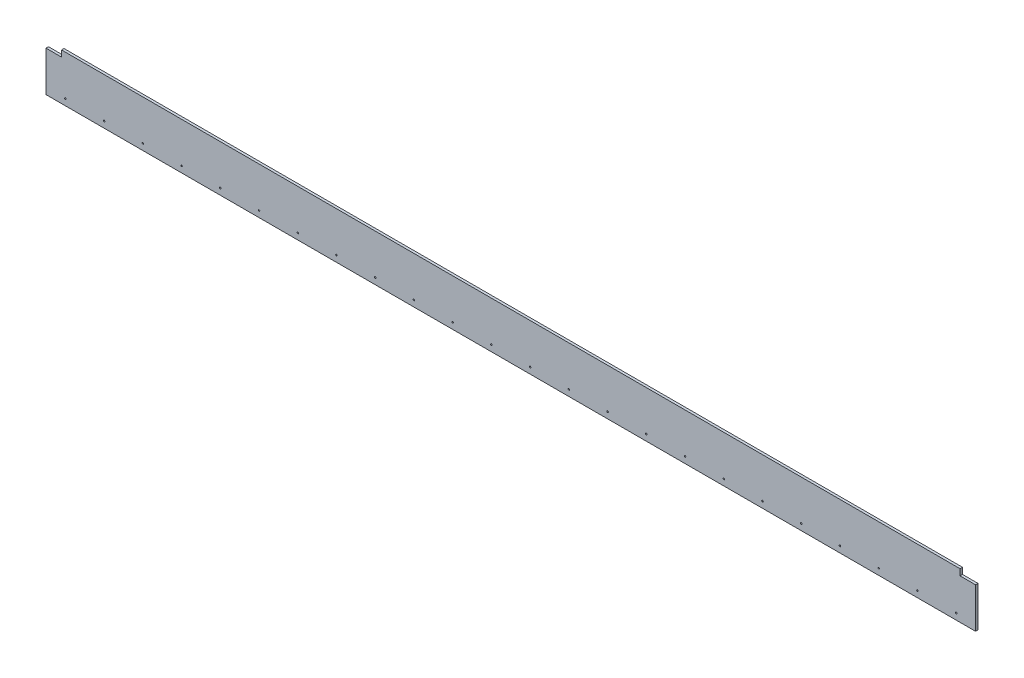
ISO-10303-21;
HEADER;
FILE_DESCRIPTION(('STEP AP214'),'2;1');
FILE_NAME('part.step','',(''),(''),'','','');
FILE_SCHEMA(('AUTOMOTIVE_DESIGN { 1 0 10303 214 1 1 1 1 }'));
ENDSEC;
DATA;
#1=APPLICATION_CONTEXT('core data for automotive mechanical design processes');
#2=APPLICATION_PROTOCOL_DEFINITION('international standard','automotive_design',2000,#1);
#3=PRODUCT_CONTEXT('',#1,'mechanical');
#4=PRODUCT('Part','Part','',(#3));
#5=PRODUCT_RELATED_PRODUCT_CATEGORY('part','',(#4));
#6=PRODUCT_DEFINITION_FORMATION('','',#4);
#7=PRODUCT_DEFINITION_CONTEXT('part definition',#1,'design');
#8=PRODUCT_DEFINITION('design','',#6,#7);
#9=PRODUCT_DEFINITION_SHAPE('','',#8);
#10=(LENGTH_UNIT() NAMED_UNIT(*) SI_UNIT(.MILLI.,.METRE.));
#11=(NAMED_UNIT(*) PLANE_ANGLE_UNIT() SI_UNIT($,.RADIAN.));
#12=(NAMED_UNIT(*) SI_UNIT($,.STERADIAN.) SOLID_ANGLE_UNIT());
#13=UNCERTAINTY_MEASURE_WITH_UNIT(LENGTH_MEASURE(1.E-05),#10,'distance_accuracy_value','');
#14=(GEOMETRIC_REPRESENTATION_CONTEXT(3) GLOBAL_UNCERTAINTY_ASSIGNED_CONTEXT((#13)) GLOBAL_UNIT_ASSIGNED_CONTEXT((#10,
#11,#12)) REPRESENTATION_CONTEXT('',''));
#15=CARTESIAN_POINT('',(0.,0.,0.));
#16=DIRECTION('',(0.,0.,1.));
#17=DIRECTION('',(1.,0.,0.));
#18=AXIS2_PLACEMENT_3D('',#15,#16,#17);
#19=CARTESIAN_POINT('',(12.5,4.,50.));
#20=DIRECTION('',(0.,0.,-1.));
#21=DIRECTION('',(-1.,0.,0.));
#22=AXIS2_PLACEMENT_3D('',#19,#20,#21);
#23=CYLINDRICAL_SURFACE('',#22,0.499999999999915);
#24=CARTESIAN_POINT('',(12.5,4.,0.));
#25=DIRECTION('',(0.,0.,-1.));
#26=DIRECTION('',(-1.,0.,0.));
#27=AXIS2_PLACEMENT_3D('',#24,#25,#26);
#28=CIRCLE('',#27,0.499999999999915);
#29=CARTESIAN_POINT('',(12.,4.,0.));
#30=VERTEX_POINT('',#29);
#31=EDGE_CURVE('E49',#30,#30,#28,.T.);
#32=ORIENTED_EDGE('',*,*,#31,.T.);
#33=EDGE_LOOP('',(#32));
#34=FACE_BOUND('',#33,.T.);
#35=CARTESIAN_POINT('',(12.5,4.,1.6));
#36=DIRECTION('',(0.,0.,-1.));
#37=DIRECTION('',(-1.,0.,0.));
#38=AXIS2_PLACEMENT_3D('',#35,#36,#37);
#39=CIRCLE('',#38,0.499999999999915);
#40=CARTESIAN_POINT('',(12.,4.,1.6));
#41=VERTEX_POINT('',#40);
#42=EDGE_CURVE('E12',#41,#41,#39,.T.);
#43=ORIENTED_EDGE('',*,*,#42,.F.);
#44=EDGE_LOOP('',(#43));
#45=FACE_BOUND('',#44,.T.);
#46=ADVANCED_FACE('F42',(#34,#45),#23,.F.);
#47=CARTESIAN_POINT('',(37.5,4.,50.));
#48=DIRECTION('',(0.,0.,-1.));
#49=DIRECTION('',(-1.,0.,0.));
#50=AXIS2_PLACEMENT_3D('',#47,#48,#49);
#51=CYLINDRICAL_SURFACE('',#50,0.499999999999915);
#52=CARTESIAN_POINT('',(37.5,4.,0.));
#53=DIRECTION('',(0.,0.,-1.));
#54=DIRECTION('',(-1.,0.,0.));
#55=AXIS2_PLACEMENT_3D('',#52,#53,#54);
#56=CIRCLE('',#55,0.499999999999915);
#57=CARTESIAN_POINT('',(37.0000000000001,4.,0.));
#58=VERTEX_POINT('',#57);
#59=EDGE_CURVE('E306',#58,#58,#56,.T.);
#60=ORIENTED_EDGE('',*,*,#59,.T.);
#61=EDGE_LOOP('',(#60));
#62=FACE_BOUND('',#61,.T.);
#63=CARTESIAN_POINT('',(37.5,4.,1.6));
#64=DIRECTION('',(0.,0.,-1.));
#65=DIRECTION('',(-1.,0.,0.));
#66=AXIS2_PLACEMENT_3D('',#63,#64,#65);
#67=CIRCLE('',#66,0.499999999999915);
#68=CARTESIAN_POINT('',(37.0000000000001,4.,1.6));
#69=VERTEX_POINT('',#68);
#70=EDGE_CURVE('E309',#69,#69,#67,.T.);
#71=ORIENTED_EDGE('',*,*,#70,.F.);
#72=EDGE_LOOP('',(#71));
#73=FACE_BOUND('',#72,.T.);
#74=ADVANCED_FACE('F332',(#62,#73),#51,.F.);
#75=CARTESIAN_POINT('',(62.5,4.,50.));
#76=DIRECTION('',(0.,0.,-1.));
#77=DIRECTION('',(-1.,0.,0.));
#78=AXIS2_PLACEMENT_3D('',#75,#76,#77);
#79=CYLINDRICAL_SURFACE('',#78,0.499999999999915);
#80=CARTESIAN_POINT('',(62.5,4.,0.));
#81=DIRECTION('',(0.,0.,-1.));
#82=DIRECTION('',(-1.,0.,0.));
#83=AXIS2_PLACEMENT_3D('',#80,#81,#82);
#84=CIRCLE('',#83,0.499999999999915);
#85=CARTESIAN_POINT('',(62.0000000000001,4.,0.));
#86=VERTEX_POINT('',#85);
#87=EDGE_CURVE('E300',#86,#86,#84,.T.);
#88=ORIENTED_EDGE('',*,*,#87,.T.);
#89=EDGE_LOOP('',(#88));
#90=FACE_BOUND('',#89,.T.);
#91=CARTESIAN_POINT('',(62.5,4.,1.6));
#92=DIRECTION('',(0.,0.,-1.));
#93=DIRECTION('',(-1.,0.,0.));
#94=AXIS2_PLACEMENT_3D('',#91,#92,#93);
#95=CIRCLE('',#94,0.499999999999915);
#96=CARTESIAN_POINT('',(62.0000000000001,4.,1.6));
#97=VERTEX_POINT('',#96);
#98=EDGE_CURVE('E303',#97,#97,#95,.T.);
#99=ORIENTED_EDGE('',*,*,#98,.F.);
#100=EDGE_LOOP('',(#99));
#101=FACE_BOUND('',#100,.T.);
#102=ADVANCED_FACE('F336',(#90,#101),#79,.F.);
#103=CARTESIAN_POINT('',(87.5,4.,50.));
#104=DIRECTION('',(0.,0.,-1.));
#105=DIRECTION('',(-1.,0.,0.));
#106=AXIS2_PLACEMENT_3D('',#103,#104,#105);
#107=CYLINDRICAL_SURFACE('',#106,0.499999999999915);
#108=CARTESIAN_POINT('',(87.5,4.,0.));
#109=DIRECTION('',(0.,0.,-1.));
#110=DIRECTION('',(-1.,0.,0.));
#111=AXIS2_PLACEMENT_3D('',#108,#109,#110);
#112=CIRCLE('',#111,0.499999999999915);
#113=CARTESIAN_POINT('',(87.0000000000001,4.,0.));
#114=VERTEX_POINT('',#113);
#115=EDGE_CURVE('E294',#114,#114,#112,.T.);
#116=ORIENTED_EDGE('',*,*,#115,.T.);
#117=EDGE_LOOP('',(#116));
#118=FACE_BOUND('',#117,.T.);
#119=CARTESIAN_POINT('',(87.5,4.,1.6));
#120=DIRECTION('',(0.,0.,-1.));
#121=DIRECTION('',(-1.,0.,0.));
#122=AXIS2_PLACEMENT_3D('',#119,#120,#121);
#123=CIRCLE('',#122,0.499999999999915);
#124=CARTESIAN_POINT('',(87.0000000000001,4.,1.6));
#125=VERTEX_POINT('',#124);
#126=EDGE_CURVE('E297',#125,#125,#123,.T.);
#127=ORIENTED_EDGE('',*,*,#126,.F.);
#128=EDGE_LOOP('',(#127));
#129=FACE_BOUND('',#128,.T.);
#130=ADVANCED_FACE('F341',(#118,#129),#107,.F.);
#131=CARTESIAN_POINT('',(112.5,4.,50.));
#132=DIRECTION('',(0.,0.,-1.));
#133=DIRECTION('',(-1.,0.,0.));
#134=AXIS2_PLACEMENT_3D('',#131,#132,#133);
#135=CYLINDRICAL_SURFACE('',#134,0.499999999999915);
#136=CARTESIAN_POINT('',(112.5,4.,0.));
#137=DIRECTION('',(0.,0.,-1.));
#138=DIRECTION('',(-1.,0.,0.));
#139=AXIS2_PLACEMENT_3D('',#136,#137,#138);
#140=CIRCLE('',#139,0.499999999999915);
#141=CARTESIAN_POINT('',(112.,4.,0.));
#142=VERTEX_POINT('',#141);
#143=EDGE_CURVE('E288',#142,#142,#140,.T.);
#144=ORIENTED_EDGE('',*,*,#143,.T.);
#145=EDGE_LOOP('',(#144));
#146=FACE_BOUND('',#145,.T.);
#147=CARTESIAN_POINT('',(112.5,4.,1.6));
#148=DIRECTION('',(0.,0.,-1.));
#149=DIRECTION('',(-1.,0.,0.));
#150=AXIS2_PLACEMENT_3D('',#147,#148,#149);
#151=CIRCLE('',#150,0.499999999999915);
#152=CARTESIAN_POINT('',(112.,4.,1.6));
#153=VERTEX_POINT('',#152);
#154=EDGE_CURVE('E291',#153,#153,#151,.T.);
#155=ORIENTED_EDGE('',*,*,#154,.F.);
#156=EDGE_LOOP('',(#155));
#157=FACE_BOUND('',#156,.T.);
#158=ADVANCED_FACE('F348',(#146,#157),#135,.F.);
#159=CARTESIAN_POINT('',(137.5,4.,50.));
#160=DIRECTION('',(0.,0.,-1.));
#161=DIRECTION('',(-1.,0.,0.));
#162=AXIS2_PLACEMENT_3D('',#159,#160,#161);
#163=CYLINDRICAL_SURFACE('',#162,0.499999999999915);
#164=CARTESIAN_POINT('',(137.5,4.,0.));
#165=DIRECTION('',(0.,0.,-1.));
#166=DIRECTION('',(-1.,0.,0.));
#167=AXIS2_PLACEMENT_3D('',#164,#165,#166);
#168=CIRCLE('',#167,0.499999999999915);
#169=CARTESIAN_POINT('',(137.,4.,0.));
#170=VERTEX_POINT('',#169);
#171=EDGE_CURVE('E282',#170,#170,#168,.T.);
#172=ORIENTED_EDGE('',*,*,#171,.T.);
#173=EDGE_LOOP('',(#172));
#174=FACE_BOUND('',#173,.T.);
#175=CARTESIAN_POINT('',(137.5,4.,1.6));
#176=DIRECTION('',(0.,0.,-1.));
#177=DIRECTION('',(-1.,0.,0.));
#178=AXIS2_PLACEMENT_3D('',#175,#176,#177);
#179=CIRCLE('',#178,0.499999999999915);
#180=CARTESIAN_POINT('',(137.,4.,1.6));
#181=VERTEX_POINT('',#180);
#182=EDGE_CURVE('E285',#181,#181,#179,.T.);
#183=ORIENTED_EDGE('',*,*,#182,.F.);
#184=EDGE_LOOP('',(#183));
#185=FACE_BOUND('',#184,.T.);
#186=ADVANCED_FACE('F352',(#174,#185),#163,.F.);
#187=CARTESIAN_POINT('',(162.5,4.,50.));
#188=DIRECTION('',(0.,0.,-1.));
#189=DIRECTION('',(-1.,0.,0.));
#190=AXIS2_PLACEMENT_3D('',#187,#188,#189);
#191=CYLINDRICAL_SURFACE('',#190,0.499999999999915);
#192=CARTESIAN_POINT('',(162.5,4.,0.));
#193=DIRECTION('',(0.,0.,-1.));
#194=DIRECTION('',(-1.,0.,0.));
#195=AXIS2_PLACEMENT_3D('',#192,#193,#194);
#196=CIRCLE('',#195,0.499999999999915);
#197=CARTESIAN_POINT('',(162.,4.,0.));
#198=VERTEX_POINT('',#197);
#199=EDGE_CURVE('E276',#198,#198,#196,.T.);
#200=ORIENTED_EDGE('',*,*,#199,.T.);
#201=EDGE_LOOP('',(#200));
#202=FACE_BOUND('',#201,.T.);
#203=CARTESIAN_POINT('',(162.5,4.,1.6));
#204=DIRECTION('',(0.,0.,-1.));
#205=DIRECTION('',(-1.,0.,0.));
#206=AXIS2_PLACEMENT_3D('',#203,#204,#205);
#207=CIRCLE('',#206,0.499999999999915);
#208=CARTESIAN_POINT('',(162.,4.,1.6));
#209=VERTEX_POINT('',#208);
#210=EDGE_CURVE('E279',#209,#209,#207,.T.);
#211=ORIENTED_EDGE('',*,*,#210,.F.);
#212=EDGE_LOOP('',(#211));
#213=FACE_BOUND('',#212,.T.);
#214=ADVANCED_FACE('F356',(#202,#213),#191,.F.);
#215=CARTESIAN_POINT('',(187.5,4.,50.));
#216=DIRECTION('',(0.,0.,-1.));
#217=DIRECTION('',(-1.,0.,0.));
#218=AXIS2_PLACEMENT_3D('',#215,#216,#217);
#219=CYLINDRICAL_SURFACE('',#218,0.499999999999915);
#220=CARTESIAN_POINT('',(187.5,4.,0.));
#221=DIRECTION('',(0.,0.,-1.));
#222=DIRECTION('',(-1.,0.,0.));
#223=AXIS2_PLACEMENT_3D('',#220,#221,#222);
#224=CIRCLE('',#223,0.499999999999915);
#225=CARTESIAN_POINT('',(187.,4.,0.));
#226=VERTEX_POINT('',#225);
#227=EDGE_CURVE('E270',#226,#226,#224,.T.);
#228=ORIENTED_EDGE('',*,*,#227,.T.);
#229=EDGE_LOOP('',(#228));
#230=FACE_BOUND('',#229,.T.);
#231=CARTESIAN_POINT('',(187.5,4.,1.6));
#232=DIRECTION('',(0.,0.,-1.));
#233=DIRECTION('',(-1.,0.,0.));
#234=AXIS2_PLACEMENT_3D('',#231,#232,#233);
#235=CIRCLE('',#234,0.499999999999915);
#236=CARTESIAN_POINT('',(187.,4.,1.6));
#237=VERTEX_POINT('',#236);
#238=EDGE_CURVE('E273',#237,#237,#235,.T.);
#239=ORIENTED_EDGE('',*,*,#238,.F.);
#240=EDGE_LOOP('',(#239));
#241=FACE_BOUND('',#240,.T.);
#242=ADVANCED_FACE('F360',(#230,#241),#219,.F.);
#243=CARTESIAN_POINT('',(212.5,4.,50.));
#244=DIRECTION('',(0.,0.,-1.));
#245=DIRECTION('',(-1.,0.,0.));
#246=AXIS2_PLACEMENT_3D('',#243,#244,#245);
#247=CYLINDRICAL_SURFACE('',#246,0.499999999999915);
#248=CARTESIAN_POINT('',(212.5,4.,0.));
#249=DIRECTION('',(0.,0.,-1.));
#250=DIRECTION('',(-1.,0.,0.));
#251=AXIS2_PLACEMENT_3D('',#248,#249,#250);
#252=CIRCLE('',#251,0.499999999999915);
#253=CARTESIAN_POINT('',(212.,4.,0.));
#254=VERTEX_POINT('',#253);
#255=EDGE_CURVE('E264',#254,#254,#252,.T.);
#256=ORIENTED_EDGE('',*,*,#255,.T.);
#257=EDGE_LOOP('',(#256));
#258=FACE_BOUND('',#257,.T.);
#259=CARTESIAN_POINT('',(212.5,4.,1.6));
#260=DIRECTION('',(0.,0.,-1.));
#261=DIRECTION('',(-1.,0.,0.));
#262=AXIS2_PLACEMENT_3D('',#259,#260,#261);
#263=CIRCLE('',#262,0.499999999999915);
#264=CARTESIAN_POINT('',(212.,4.,1.6));
#265=VERTEX_POINT('',#264);
#266=EDGE_CURVE('E267',#265,#265,#263,.T.);
#267=ORIENTED_EDGE('',*,*,#266,.F.);
#268=EDGE_LOOP('',(#267));
#269=FACE_BOUND('',#268,.T.);
#270=ADVANCED_FACE('F364',(#258,#269),#247,.F.);
#271=CARTESIAN_POINT('',(237.5,4.,50.));
#272=DIRECTION('',(0.,0.,-1.));
#273=DIRECTION('',(-1.,0.,0.));
#274=AXIS2_PLACEMENT_3D('',#271,#272,#273);
#275=CYLINDRICAL_SURFACE('',#274,0.499999999999915);
#276=CARTESIAN_POINT('',(237.5,4.,0.));
#277=DIRECTION('',(0.,0.,-1.));
#278=DIRECTION('',(-1.,0.,0.));
#279=AXIS2_PLACEMENT_3D('',#276,#277,#278);
#280=CIRCLE('',#279,0.499999999999915);
#281=CARTESIAN_POINT('',(237.,4.,0.));
#282=VERTEX_POINT('',#281);
#283=EDGE_CURVE('E258',#282,#282,#280,.T.);
#284=ORIENTED_EDGE('',*,*,#283,.T.);
#285=EDGE_LOOP('',(#284));
#286=FACE_BOUND('',#285,.T.);
#287=CARTESIAN_POINT('',(237.5,4.,1.6));
#288=DIRECTION('',(0.,0.,-1.));
#289=DIRECTION('',(-1.,0.,0.));
#290=AXIS2_PLACEMENT_3D('',#287,#288,#289);
#291=CIRCLE('',#290,0.499999999999915);
#292=CARTESIAN_POINT('',(237.,4.,1.6));
#293=VERTEX_POINT('',#292);
#294=EDGE_CURVE('E261',#293,#293,#291,.T.);
#295=ORIENTED_EDGE('',*,*,#294,.F.);
#296=EDGE_LOOP('',(#295));
#297=FACE_BOUND('',#296,.T.);
#298=ADVANCED_FACE('F368',(#286,#297),#275,.F.);
#299=CARTESIAN_POINT('',(262.5,4.,50.));
#300=DIRECTION('',(0.,0.,-1.));
#301=DIRECTION('',(-1.,0.,0.));
#302=AXIS2_PLACEMENT_3D('',#299,#300,#301);
#303=CYLINDRICAL_SURFACE('',#302,0.499999999999915);
#304=CARTESIAN_POINT('',(262.5,4.,0.));
#305=DIRECTION('',(0.,0.,-1.));
#306=DIRECTION('',(-1.,0.,0.));
#307=AXIS2_PLACEMENT_3D('',#304,#305,#306);
#308=CIRCLE('',#307,0.499999999999915);
#309=CARTESIAN_POINT('',(262.,4.,0.));
#310=VERTEX_POINT('',#309);
#311=EDGE_CURVE('E252',#310,#310,#308,.T.);
#312=ORIENTED_EDGE('',*,*,#311,.T.);
#313=EDGE_LOOP('',(#312));
#314=FACE_BOUND('',#313,.T.);
#315=CARTESIAN_POINT('',(262.5,4.,1.6));
#316=DIRECTION('',(0.,0.,-1.));
#317=DIRECTION('',(-1.,0.,0.));
#318=AXIS2_PLACEMENT_3D('',#315,#316,#317);
#319=CIRCLE('',#318,0.499999999999915);
#320=CARTESIAN_POINT('',(262.,4.,1.6));
#321=VERTEX_POINT('',#320);
#322=EDGE_CURVE('E255',#321,#321,#319,.T.);
#323=ORIENTED_EDGE('',*,*,#322,.F.);
#324=EDGE_LOOP('',(#323));
#325=FACE_BOUND('',#324,.T.);
#326=ADVANCED_FACE('F372',(#314,#325),#303,.F.);
#327=CARTESIAN_POINT('',(287.5,4.,50.));
#328=DIRECTION('',(0.,0.,-1.));
#329=DIRECTION('',(-1.,0.,0.));
#330=AXIS2_PLACEMENT_3D('',#327,#328,#329);
#331=CYLINDRICAL_SURFACE('',#330,0.499999999999915);
#332=CARTESIAN_POINT('',(287.5,4.,0.));
#333=DIRECTION('',(0.,0.,-1.));
#334=DIRECTION('',(-1.,0.,0.));
#335=AXIS2_PLACEMENT_3D('',#332,#333,#334);
#336=CIRCLE('',#335,0.499999999999915);
#337=CARTESIAN_POINT('',(287.,4.,0.));
#338=VERTEX_POINT('',#337);
#339=EDGE_CURVE('E246',#338,#338,#336,.T.);
#340=ORIENTED_EDGE('',*,*,#339,.T.);
#341=EDGE_LOOP('',(#340));
#342=FACE_BOUND('',#341,.T.);
#343=CARTESIAN_POINT('',(287.5,4.,1.6));
#344=DIRECTION('',(0.,0.,-1.));
#345=DIRECTION('',(-1.,0.,0.));
#346=AXIS2_PLACEMENT_3D('',#343,#344,#345);
#347=CIRCLE('',#346,0.499999999999915);
#348=CARTESIAN_POINT('',(287.,4.,1.6));
#349=VERTEX_POINT('',#348);
#350=EDGE_CURVE('E249',#349,#349,#347,.T.);
#351=ORIENTED_EDGE('',*,*,#350,.F.);
#352=EDGE_LOOP('',(#351));
#353=FACE_BOUND('',#352,.T.);
#354=ADVANCED_FACE('F376',(#342,#353),#331,.F.);
#355=CARTESIAN_POINT('',(312.5,4.,50.));
#356=DIRECTION('',(0.,0.,-1.));
#357=DIRECTION('',(-1.,0.,0.));
#358=AXIS2_PLACEMENT_3D('',#355,#356,#357);
#359=CYLINDRICAL_SURFACE('',#358,0.499999999999915);
#360=CARTESIAN_POINT('',(312.5,4.,0.));
#361=DIRECTION('',(0.,0.,-1.));
#362=DIRECTION('',(-1.,0.,0.));
#363=AXIS2_PLACEMENT_3D('',#360,#361,#362);
#364=CIRCLE('',#363,0.499999999999915);
#365=CARTESIAN_POINT('',(312.,4.,0.));
#366=VERTEX_POINT('',#365);
#367=EDGE_CURVE('E240',#366,#366,#364,.T.);
#368=ORIENTED_EDGE('',*,*,#367,.T.);
#369=EDGE_LOOP('',(#368));
#370=FACE_BOUND('',#369,.T.);
#371=CARTESIAN_POINT('',(312.5,4.,1.6));
#372=DIRECTION('',(0.,0.,-1.));
#373=DIRECTION('',(-1.,0.,0.));
#374=AXIS2_PLACEMENT_3D('',#371,#372,#373);
#375=CIRCLE('',#374,0.499999999999915);
#376=CARTESIAN_POINT('',(312.,4.,1.6));
#377=VERTEX_POINT('',#376);
#378=EDGE_CURVE('E243',#377,#377,#375,.T.);
#379=ORIENTED_EDGE('',*,*,#378,.F.);
#380=EDGE_LOOP('',(#379));
#381=FACE_BOUND('',#380,.T.);
#382=ADVANCED_FACE('F380',(#370,#381),#359,.F.);
#383=CARTESIAN_POINT('',(337.5,4.,50.));
#384=DIRECTION('',(0.,0.,-1.));
#385=DIRECTION('',(-1.,0.,0.));
#386=AXIS2_PLACEMENT_3D('',#383,#384,#385);
#387=CYLINDRICAL_SURFACE('',#386,0.499999999999915);
#388=CARTESIAN_POINT('',(337.5,4.,0.));
#389=DIRECTION('',(0.,0.,-1.));
#390=DIRECTION('',(-1.,0.,0.));
#391=AXIS2_PLACEMENT_3D('',#388,#389,#390);
#392=CIRCLE('',#391,0.499999999999915);
#393=CARTESIAN_POINT('',(337.,4.,0.));
#394=VERTEX_POINT('',#393);
#395=EDGE_CURVE('E234',#394,#394,#392,.T.);
#396=ORIENTED_EDGE('',*,*,#395,.T.);
#397=EDGE_LOOP('',(#396));
#398=FACE_BOUND('',#397,.T.);
#399=CARTESIAN_POINT('',(337.5,4.,1.6));
#400=DIRECTION('',(0.,0.,-1.));
#401=DIRECTION('',(-1.,0.,0.));
#402=AXIS2_PLACEMENT_3D('',#399,#400,#401);
#403=CIRCLE('',#402,0.499999999999915);
#404=CARTESIAN_POINT('',(337.,4.,1.6));
#405=VERTEX_POINT('',#404);
#406=EDGE_CURVE('E237',#405,#405,#403,.T.);
#407=ORIENTED_EDGE('',*,*,#406,.F.);
#408=EDGE_LOOP('',(#407));
#409=FACE_BOUND('',#408,.T.);
#410=ADVANCED_FACE('F384',(#398,#409),#387,.F.);
#411=CARTESIAN_POINT('',(362.5,4.,50.));
#412=DIRECTION('',(0.,0.,-1.));
#413=DIRECTION('',(-1.,0.,0.));
#414=AXIS2_PLACEMENT_3D('',#411,#412,#413);
#415=CYLINDRICAL_SURFACE('',#414,0.499999999999915);
#416=CARTESIAN_POINT('',(362.5,4.,0.));
#417=DIRECTION('',(0.,0.,-1.));
#418=DIRECTION('',(-1.,0.,0.));
#419=AXIS2_PLACEMENT_3D('',#416,#417,#418);
#420=CIRCLE('',#419,0.499999999999915);
#421=CARTESIAN_POINT('',(362.,4.,0.));
#422=VERTEX_POINT('',#421);
#423=EDGE_CURVE('E228',#422,#422,#420,.T.);
#424=ORIENTED_EDGE('',*,*,#423,.T.);
#425=EDGE_LOOP('',(#424));
#426=FACE_BOUND('',#425,.T.);
#427=CARTESIAN_POINT('',(362.5,4.,1.6));
#428=DIRECTION('',(0.,0.,-1.));
#429=DIRECTION('',(-1.,0.,0.));
#430=AXIS2_PLACEMENT_3D('',#427,#428,#429);
#431=CIRCLE('',#430,0.499999999999915);
#432=CARTESIAN_POINT('',(362.,4.,1.6));
#433=VERTEX_POINT('',#432);
#434=EDGE_CURVE('E231',#433,#433,#431,.T.);
#435=ORIENTED_EDGE('',*,*,#434,.F.);
#436=EDGE_LOOP('',(#435));
#437=FACE_BOUND('',#436,.T.);
#438=ADVANCED_FACE('F388',(#426,#437),#415,.F.);
#439=CARTESIAN_POINT('',(387.5,4.,50.));
#440=DIRECTION('',(0.,0.,-1.));
#441=DIRECTION('',(-1.,0.,0.));
#442=AXIS2_PLACEMENT_3D('',#439,#440,#441);
#443=CYLINDRICAL_SURFACE('',#442,0.499999999999915);
#444=CARTESIAN_POINT('',(387.5,4.,0.));
#445=DIRECTION('',(0.,0.,-1.));
#446=DIRECTION('',(-1.,0.,0.));
#447=AXIS2_PLACEMENT_3D('',#444,#445,#446);
#448=CIRCLE('',#447,0.499999999999915);
#449=CARTESIAN_POINT('',(387.,4.,0.));
#450=VERTEX_POINT('',#449);
#451=EDGE_CURVE('E222',#450,#450,#448,.T.);
#452=ORIENTED_EDGE('',*,*,#451,.T.);
#453=EDGE_LOOP('',(#452));
#454=FACE_BOUND('',#453,.T.);
#455=CARTESIAN_POINT('',(387.5,4.,1.6));
#456=DIRECTION('',(0.,0.,-1.));
#457=DIRECTION('',(-1.,0.,0.));
#458=AXIS2_PLACEMENT_3D('',#455,#456,#457);
#459=CIRCLE('',#458,0.499999999999915);
#460=CARTESIAN_POINT('',(387.,4.,1.6));
#461=VERTEX_POINT('',#460);
#462=EDGE_CURVE('E225',#461,#461,#459,.T.);
#463=ORIENTED_EDGE('',*,*,#462,.F.);
#464=EDGE_LOOP('',(#463));
#465=FACE_BOUND('',#464,.T.);
#466=ADVANCED_FACE('F392',(#454,#465),#443,.F.);
#467=CARTESIAN_POINT('',(412.5,4.,50.));
#468=DIRECTION('',(0.,0.,-1.));
#469=DIRECTION('',(-1.,0.,0.));
#470=AXIS2_PLACEMENT_3D('',#467,#468,#469);
#471=CYLINDRICAL_SURFACE('',#470,0.499999999999915);
#472=CARTESIAN_POINT('',(412.5,4.,0.));
#473=DIRECTION('',(0.,0.,-1.));
#474=DIRECTION('',(-1.,0.,0.));
#475=AXIS2_PLACEMENT_3D('',#472,#473,#474);
#476=CIRCLE('',#475,0.499999999999915);
#477=CARTESIAN_POINT('',(412.,4.,0.));
#478=VERTEX_POINT('',#477);
#479=EDGE_CURVE('E216',#478,#478,#476,.T.);
#480=ORIENTED_EDGE('',*,*,#479,.T.);
#481=EDGE_LOOP('',(#480));
#482=FACE_BOUND('',#481,.T.);
#483=CARTESIAN_POINT('',(412.5,4.,1.6));
#484=DIRECTION('',(0.,0.,-1.));
#485=DIRECTION('',(-1.,0.,0.));
#486=AXIS2_PLACEMENT_3D('',#483,#484,#485);
#487=CIRCLE('',#486,0.499999999999915);
#488=CARTESIAN_POINT('',(412.,4.,1.6));
#489=VERTEX_POINT('',#488);
#490=EDGE_CURVE('E219',#489,#489,#487,.T.);
#491=ORIENTED_EDGE('',*,*,#490,.F.);
#492=EDGE_LOOP('',(#491));
#493=FACE_BOUND('',#492,.T.);
#494=ADVANCED_FACE('F396',(#482,#493),#471,.F.);
#495=CARTESIAN_POINT('',(437.5,4.,50.));
#496=DIRECTION('',(0.,0.,-1.));
#497=DIRECTION('',(-1.,0.,0.));
#498=AXIS2_PLACEMENT_3D('',#495,#496,#497);
#499=CYLINDRICAL_SURFACE('',#498,0.499999999999915);
#500=CARTESIAN_POINT('',(437.5,4.,0.));
#501=DIRECTION('',(0.,0.,-1.));
#502=DIRECTION('',(-1.,0.,0.));
#503=AXIS2_PLACEMENT_3D('',#500,#501,#502);
#504=CIRCLE('',#503,0.499999999999915);
#505=CARTESIAN_POINT('',(437.,4.,0.));
#506=VERTEX_POINT('',#505);
#507=EDGE_CURVE('E210',#506,#506,#504,.T.);
#508=ORIENTED_EDGE('',*,*,#507,.T.);
#509=EDGE_LOOP('',(#508));
#510=FACE_BOUND('',#509,.T.);
#511=CARTESIAN_POINT('',(437.5,4.,1.6));
#512=DIRECTION('',(0.,0.,-1.));
#513=DIRECTION('',(-1.,0.,0.));
#514=AXIS2_PLACEMENT_3D('',#511,#512,#513);
#515=CIRCLE('',#514,0.499999999999915);
#516=CARTESIAN_POINT('',(437.,4.,1.6));
#517=VERTEX_POINT('',#516);
#518=EDGE_CURVE('E213',#517,#517,#515,.T.);
#519=ORIENTED_EDGE('',*,*,#518,.F.);
#520=EDGE_LOOP('',(#519));
#521=FACE_BOUND('',#520,.T.);
#522=ADVANCED_FACE('F400',(#510,#521),#499,.F.);
#523=CARTESIAN_POINT('',(462.5,4.,50.));
#524=DIRECTION('',(0.,0.,-1.));
#525=DIRECTION('',(-1.,0.,0.));
#526=AXIS2_PLACEMENT_3D('',#523,#524,#525);
#527=CYLINDRICAL_SURFACE('',#526,0.499999999999915);
#528=CARTESIAN_POINT('',(462.5,4.,0.));
#529=DIRECTION('',(0.,0.,-1.));
#530=DIRECTION('',(-1.,0.,0.));
#531=AXIS2_PLACEMENT_3D('',#528,#529,#530);
#532=CIRCLE('',#531,0.499999999999915);
#533=CARTESIAN_POINT('',(462.,4.,0.));
#534=VERTEX_POINT('',#533);
#535=EDGE_CURVE('E204',#534,#534,#532,.T.);
#536=ORIENTED_EDGE('',*,*,#535,.T.);
#537=EDGE_LOOP('',(#536));
#538=FACE_BOUND('',#537,.T.);
#539=CARTESIAN_POINT('',(462.5,4.,1.6));
#540=DIRECTION('',(0.,0.,-1.));
#541=DIRECTION('',(-1.,0.,0.));
#542=AXIS2_PLACEMENT_3D('',#539,#540,#541);
#543=CIRCLE('',#542,0.499999999999915);
#544=CARTESIAN_POINT('',(462.,4.,1.6));
#545=VERTEX_POINT('',#544);
#546=EDGE_CURVE('E207',#545,#545,#543,.T.);
#547=ORIENTED_EDGE('',*,*,#546,.F.);
#548=EDGE_LOOP('',(#547));
#549=FACE_BOUND('',#548,.T.);
#550=ADVANCED_FACE('F404',(#538,#549),#527,.F.);
#551=CARTESIAN_POINT('',(487.5,4.,50.));
#552=DIRECTION('',(0.,0.,-1.));
#553=DIRECTION('',(-1.,0.,0.));
#554=AXIS2_PLACEMENT_3D('',#551,#552,#553);
#555=CYLINDRICAL_SURFACE('',#554,0.499999999999915);
#556=CARTESIAN_POINT('',(487.5,4.,0.));
#557=DIRECTION('',(0.,0.,-1.));
#558=DIRECTION('',(-1.,0.,0.));
#559=AXIS2_PLACEMENT_3D('',#556,#557,#558);
#560=CIRCLE('',#559,0.499999999999915);
#561=CARTESIAN_POINT('',(487.,4.,0.));
#562=VERTEX_POINT('',#561);
#563=EDGE_CURVE('E198',#562,#562,#560,.T.);
#564=ORIENTED_EDGE('',*,*,#563,.T.);
#565=EDGE_LOOP('',(#564));
#566=FACE_BOUND('',#565,.T.);
#567=CARTESIAN_POINT('',(487.5,4.,1.6));
#568=DIRECTION('',(0.,0.,-1.));
#569=DIRECTION('',(-1.,0.,0.));
#570=AXIS2_PLACEMENT_3D('',#567,#568,#569);
#571=CIRCLE('',#570,0.499999999999915);
#572=CARTESIAN_POINT('',(487.,4.,1.6));
#573=VERTEX_POINT('',#572);
#574=EDGE_CURVE('E201',#573,#573,#571,.T.);
#575=ORIENTED_EDGE('',*,*,#574,.F.);
#576=EDGE_LOOP('',(#575));
#577=FACE_BOUND('',#576,.T.);
#578=ADVANCED_FACE('F408',(#566,#577),#555,.F.);
#579=CARTESIAN_POINT('',(512.5,4.,50.));
#580=DIRECTION('',(0.,0.,-1.));
#581=DIRECTION('',(-1.,0.,0.));
#582=AXIS2_PLACEMENT_3D('',#579,#580,#581);
#583=CYLINDRICAL_SURFACE('',#582,0.499999999999915);
#584=CARTESIAN_POINT('',(512.5,4.,0.));
#585=DIRECTION('',(0.,0.,-1.));
#586=DIRECTION('',(-1.,0.,0.));
#587=AXIS2_PLACEMENT_3D('',#584,#585,#586);
#588=CIRCLE('',#587,0.499999999999915);
#589=CARTESIAN_POINT('',(512.,4.,0.));
#590=VERTEX_POINT('',#589);
#591=EDGE_CURVE('E192',#590,#590,#588,.T.);
#592=ORIENTED_EDGE('',*,*,#591,.T.);
#593=EDGE_LOOP('',(#592));
#594=FACE_BOUND('',#593,.T.);
#595=CARTESIAN_POINT('',(512.5,4.,1.6));
#596=DIRECTION('',(0.,0.,-1.));
#597=DIRECTION('',(-1.,0.,0.));
#598=AXIS2_PLACEMENT_3D('',#595,#596,#597);
#599=CIRCLE('',#598,0.499999999999915);
#600=CARTESIAN_POINT('',(512.,4.,1.6));
#601=VERTEX_POINT('',#600);
#602=EDGE_CURVE('E195',#601,#601,#599,.T.);
#603=ORIENTED_EDGE('',*,*,#602,.F.);
#604=EDGE_LOOP('',(#603));
#605=FACE_BOUND('',#604,.T.);
#606=ADVANCED_FACE('F412',(#594,#605),#583,.F.);
#607=CARTESIAN_POINT('',(537.5,4.,50.));
#608=DIRECTION('',(0.,0.,-1.));
#609=DIRECTION('',(-1.,0.,0.));
#610=AXIS2_PLACEMENT_3D('',#607,#608,#609);
#611=CYLINDRICAL_SURFACE('',#610,0.499999999999915);
#612=CARTESIAN_POINT('',(537.5,4.,0.));
#613=DIRECTION('',(0.,0.,-1.));
#614=DIRECTION('',(-1.,0.,0.));
#615=AXIS2_PLACEMENT_3D('',#612,#613,#614);
#616=CIRCLE('',#615,0.499999999999915);
#617=CARTESIAN_POINT('',(537.,4.,0.));
#618=VERTEX_POINT('',#617);
#619=EDGE_CURVE('E186',#618,#618,#616,.T.);
#620=ORIENTED_EDGE('',*,*,#619,.T.);
#621=EDGE_LOOP('',(#620));
#622=FACE_BOUND('',#621,.T.);
#623=CARTESIAN_POINT('',(537.5,4.,1.6));
#624=DIRECTION('',(0.,0.,-1.));
#625=DIRECTION('',(-1.,0.,0.));
#626=AXIS2_PLACEMENT_3D('',#623,#624,#625);
#627=CIRCLE('',#626,0.499999999999915);
#628=CARTESIAN_POINT('',(537.,4.,1.6));
#629=VERTEX_POINT('',#628);
#630=EDGE_CURVE('E189',#629,#629,#627,.T.);
#631=ORIENTED_EDGE('',*,*,#630,.F.);
#632=EDGE_LOOP('',(#631));
#633=FACE_BOUND('',#632,.T.);
#634=ADVANCED_FACE('F416',(#622,#633),#611,.F.);
#635=CARTESIAN_POINT('',(0.,0.,1.6));
#636=DIRECTION('',(1.,0.,0.));
#637=DIRECTION('',(0.,0.,-1.));
#638=AXIS2_PLACEMENT_3D('',#635,#636,#637);
#639=PLANE('',#638);
#640=DIRECTION('',(0.,-1.,0.));
#641=VECTOR('',#640,1.);
#642=CARTESIAN_POINT('',(0.,0.,1.6));
#643=LINE('',#642,#641);
#644=CARTESIAN_POINT('',(0.,26.,1.6));
#645=VERTEX_POINT('',#644);
#646=CARTESIAN_POINT('',(0.,0.,1.6));
#647=VERTEX_POINT('',#646);
#648=EDGE_CURVE('E164',#645,#647,#643,.T.);
#649=ORIENTED_EDGE('',*,*,#648,.F.);
#650=DIRECTION('',(0.,0.,-1.));
#651=VECTOR('',#650,1.);
#652=CARTESIAN_POINT('',(0.,26.,30.));
#653=LINE('',#652,#651);
#654=CARTESIAN_POINT('',(0.,26.,0.));
#655=VERTEX_POINT('',#654);
#656=EDGE_CURVE('E122',#645,#655,#653,.T.);
#657=ORIENTED_EDGE('',*,*,#656,.T.);
#658=DIRECTION('',(0.,-1.,0.));
#659=VECTOR('',#658,1.);
#660=CARTESIAN_POINT('',(0.,0.,0.));
#661=LINE('',#660,#659);
#662=CARTESIAN_POINT('',(0.,0.,0.));
#663=VERTEX_POINT('',#662);
#664=EDGE_CURVE('E163',#655,#663,#661,.T.);
#665=ORIENTED_EDGE('',*,*,#664,.T.);
#666=DIRECTION('',(0.,0.,-1.));
#667=VECTOR('',#666,1.);
#668=CARTESIAN_POINT('',(0.,0.,1.6));
#669=LINE('',#668,#667);
#670=EDGE_CURVE('E183',#647,#663,#669,.T.);
#671=ORIENTED_EDGE('',*,*,#670,.F.);
#672=EDGE_LOOP('',(#649,#657,#665,#671));
#673=FACE_BOUND('',#672,.T.);
#674=ADVANCED_FACE('F420',(#673),#639,.F.);
#675=CARTESIAN_POINT('',(0.,0.,1.6));
#676=DIRECTION('',(0.,1.,0.));
#677=DIRECTION('',(0.,0.,1.));
#678=AXIS2_PLACEMENT_3D('',#675,#676,#677);
#679=PLANE('',#678);
#680=DIRECTION('',(1.,0.,0.));
#681=VECTOR('',#680,1.);
#682=CARTESIAN_POINT('',(0.,0.,0.));
#683=LINE('',#682,#681);
#684=CARTESIAN_POINT('',(600.,0.,0.));
#685=VERTEX_POINT('',#684);
#686=EDGE_CURVE('E176',#663,#685,#683,.T.);
#687=ORIENTED_EDGE('',*,*,#686,.T.);
#688=DIRECTION('',(0.,0.,-1.));
#689=VECTOR('',#688,1.);
#690=CARTESIAN_POINT('',(600.,0.,1.6));
#691=LINE('',#690,#689);
#692=CARTESIAN_POINT('',(600.,0.,1.6));
#693=VERTEX_POINT('',#692);
#694=EDGE_CURVE('E174',#693,#685,#691,.T.);
#695=ORIENTED_EDGE('',*,*,#694,.F.);
#696=DIRECTION('',(1.,0.,0.));
#697=VECTOR('',#696,1.);
#698=CARTESIAN_POINT('',(0.,0.,1.6));
#699=LINE('',#698,#697);
#700=EDGE_CURVE('E166',#647,#693,#699,.T.);
#701=ORIENTED_EDGE('',*,*,#700,.F.);
#702=ORIENTED_EDGE('',*,*,#670,.T.);
#703=EDGE_LOOP('',(#687,#695,#701,#702));
#704=FACE_BOUND('',#703,.T.);
#705=ADVANCED_FACE('F424',(#704),#679,.F.);
#706=CARTESIAN_POINT('',(600.,0.,1.6));
#707=DIRECTION('',(-1.,0.,0.));
#708=DIRECTION('',(0.,0.,1.));
#709=AXIS2_PLACEMENT_3D('',#706,#707,#708);
#710=PLANE('',#709);
#711=DIRECTION('',(0.,1.,0.));
#712=VECTOR('',#711,1.);
#713=CARTESIAN_POINT('',(600.,0.,0.));
#714=LINE('',#713,#712);
#715=CARTESIAN_POINT('',(600.,26.,0.));
#716=VERTEX_POINT('',#715);
#717=EDGE_CURVE('E178',#685,#716,#714,.T.);
#718=ORIENTED_EDGE('',*,*,#717,.T.);
#719=DIRECTION('',(0.,0.,-1.));
#720=VECTOR('',#719,1.);
#721=CARTESIAN_POINT('',(600.,26.,30.));
#722=LINE('',#721,#720);
#723=CARTESIAN_POINT('',(600.,26.,1.6));
#724=VERTEX_POINT('',#723);
#725=EDGE_CURVE('E56',#724,#716,#722,.T.);
#726=ORIENTED_EDGE('',*,*,#725,.F.);
#727=DIRECTION('',(0.,1.,0.));
#728=VECTOR('',#727,1.);
#729=CARTESIAN_POINT('',(600.,0.,1.6));
#730=LINE('',#729,#728);
#731=EDGE_CURVE('E168',#693,#724,#730,.T.);
#732=ORIENTED_EDGE('',*,*,#731,.F.);
#733=ORIENTED_EDGE('',*,*,#694,.T.);
#734=EDGE_LOOP('',(#718,#726,#732,#733));
#735=FACE_BOUND('',#734,.T.);
#736=ADVANCED_FACE('F428',(#735),#710,.F.);
#737=CARTESIAN_POINT('',(0.,30.,1.6));
#738=DIRECTION('',(0.,-1.,0.));
#739=DIRECTION('',(0.,0.,-1.));
#740=AXIS2_PLACEMENT_3D('',#737,#738,#739);
#741=PLANE('',#740);
#742=DIRECTION('',(-1.,0.,0.));
#743=VECTOR('',#742,1.);
#744=CARTESIAN_POINT('',(0.,30.,1.6));
#745=LINE('',#744,#743);
#746=CARTESIAN_POINT('',(590.,30.,1.6));
#747=VERTEX_POINT('',#746);
#748=CARTESIAN_POINT('',(10.,30.,1.6));
#749=VERTEX_POINT('',#748);
#750=EDGE_CURVE('E171',#747,#749,#745,.T.);
#751=ORIENTED_EDGE('',*,*,#750,.F.);
#752=DIRECTION('',(0.,0.,-1.));
#753=VECTOR('',#752,1.);
#754=CARTESIAN_POINT('',(590.,30.,30.));
#755=LINE('',#754,#753);
#756=CARTESIAN_POINT('',(590.,30.,0.));
#757=VERTEX_POINT('',#756);
#758=EDGE_CURVE('E115',#747,#757,#755,.T.);
#759=ORIENTED_EDGE('',*,*,#758,.T.);
#760=DIRECTION('',(-1.,0.,0.));
#761=VECTOR('',#760,1.);
#762=CARTESIAN_POINT('',(0.,30.,0.));
#763=LINE('',#762,#761);
#764=CARTESIAN_POINT('',(10.,30.,0.));
#765=VERTEX_POINT('',#764);
#766=EDGE_CURVE('E128',#757,#765,#763,.T.);
#767=ORIENTED_EDGE('',*,*,#766,.T.);
#768=DIRECTION('',(0.,0.,-1.));
#769=VECTOR('',#768,1.);
#770=CARTESIAN_POINT('',(10.,30.,30.));
#771=LINE('',#770,#769);
#772=EDGE_CURVE('E64',#749,#765,#771,.T.);
#773=ORIENTED_EDGE('',*,*,#772,.F.);
#774=EDGE_LOOP('',(#751,#759,#767,#773));
#775=FACE_BOUND('',#774,.T.);
#776=ADVANCED_FACE('F327',(#775),#741,.F.);
#777=CARTESIAN_POINT('',(0.,0.,1.6));
#778=DIRECTION('',(0.,0.,-1.));
#779=DIRECTION('',(-1.,0.,0.));
#780=AXIS2_PLACEMENT_3D('',#777,#778,#779);
#781=PLANE('',#780);
#782=CARTESIAN_POINT('',(562.5,4.,1.6));
#783=DIRECTION('',(0.,0.,-1.));
#784=DIRECTION('',(-1.,0.,0.));
#785=AXIS2_PLACEMENT_3D('',#782,#783,#784);
#786=CIRCLE('',#785,0.499999999999915);
#787=CARTESIAN_POINT('',(562.,4.,1.6));
#788=VERTEX_POINT('',#787);
#789=EDGE_CURVE('E154',#788,#788,#786,.T.);
#790=ORIENTED_EDGE('',*,*,#789,.T.);
#791=EDGE_LOOP('',(#790));
#792=FACE_BOUND('',#791,.T.);
#793=CARTESIAN_POINT('',(587.5,4.,1.6));
#794=DIRECTION('',(0.,0.,-1.));
#795=DIRECTION('',(-1.,0.,0.));
#796=AXIS2_PLACEMENT_3D('',#793,#794,#795);
#797=CIRCLE('',#796,0.499999999999915);
#798=CARTESIAN_POINT('',(587.,4.,1.6));
#799=VERTEX_POINT('',#798);
#800=EDGE_CURVE('E160',#799,#799,#797,.T.);
#801=ORIENTED_EDGE('',*,*,#800,.T.);
#802=EDGE_LOOP('',(#801));
#803=FACE_BOUND('',#802,.T.);
#804=DIRECTION('',(-1.,0.,0.));
#805=VECTOR('',#804,1.);
#806=CARTESIAN_POINT('',(0.,26.,1.6));
#807=LINE('',#806,#805);
#808=CARTESIAN_POINT('',(590.,26.,1.6));
#809=VERTEX_POINT('',#808);
#810=EDGE_CURVE('E148',#724,#809,#807,.T.);
#811=ORIENTED_EDGE('',*,*,#810,.T.);
#812=DIRECTION('',(0.,1.,0.));
#813=VECTOR('',#812,1.);
#814=CARTESIAN_POINT('',(590.,0.,1.6));
#815=LINE('',#814,#813);
#816=EDGE_CURVE('E113',#809,#747,#815,.T.);
#817=ORIENTED_EDGE('',*,*,#816,.T.);
#818=ORIENTED_EDGE('',*,*,#750,.T.);
#819=DIRECTION('',(0.,-1.,0.));
#820=VECTOR('',#819,1.);
#821=CARTESIAN_POINT('',(10.,0.,1.6));
#822=LINE('',#821,#820);
#823=CARTESIAN_POINT('',(10.,26.,1.6));
#824=VERTEX_POINT('',#823);
#825=EDGE_CURVE('E132',#749,#824,#822,.T.);
#826=ORIENTED_EDGE('',*,*,#825,.T.);
#827=DIRECTION('',(-1.,0.,0.));
#828=VECTOR('',#827,1.);
#829=CARTESIAN_POINT('',(0.,26.,1.6));
#830=LINE('',#829,#828);
#831=EDGE_CURVE('E145',#824,#645,#830,.T.);
#832=ORIENTED_EDGE('',*,*,#831,.T.);
#833=ORIENTED_EDGE('',*,*,#648,.T.);
#834=ORIENTED_EDGE('',*,*,#700,.T.);
#835=ORIENTED_EDGE('',*,*,#731,.T.);
#836=EDGE_LOOP('',(#811,#817,#818,#826,#832,#833,#834,#835));
#837=FACE_BOUND('',#836,.T.);
#838=ORIENTED_EDGE('',*,*,#630,.T.);
#839=EDGE_LOOP('',(#838));
#840=FACE_BOUND('',#839,.T.);
#841=ORIENTED_EDGE('',*,*,#602,.T.);
#842=EDGE_LOOP('',(#841));
#843=FACE_BOUND('',#842,.T.);
#844=ORIENTED_EDGE('',*,*,#574,.T.);
#845=EDGE_LOOP('',(#844));
#846=FACE_BOUND('',#845,.T.);
#847=ORIENTED_EDGE('',*,*,#546,.T.);
#848=EDGE_LOOP('',(#847));
#849=FACE_BOUND('',#848,.T.);
#850=ORIENTED_EDGE('',*,*,#518,.T.);
#851=EDGE_LOOP('',(#850));
#852=FACE_BOUND('',#851,.T.);
#853=ORIENTED_EDGE('',*,*,#490,.T.);
#854=EDGE_LOOP('',(#853));
#855=FACE_BOUND('',#854,.T.);
#856=ORIENTED_EDGE('',*,*,#462,.T.);
#857=EDGE_LOOP('',(#856));
#858=FACE_BOUND('',#857,.T.);
#859=ORIENTED_EDGE('',*,*,#434,.T.);
#860=EDGE_LOOP('',(#859));
#861=FACE_BOUND('',#860,.T.);
#862=ORIENTED_EDGE('',*,*,#406,.T.);
#863=EDGE_LOOP('',(#862));
#864=FACE_BOUND('',#863,.T.);
#865=ORIENTED_EDGE('',*,*,#378,.T.);
#866=EDGE_LOOP('',(#865));
#867=FACE_BOUND('',#866,.T.);
#868=ORIENTED_EDGE('',*,*,#350,.T.);
#869=EDGE_LOOP('',(#868));
#870=FACE_BOUND('',#869,.T.);
#871=ORIENTED_EDGE('',*,*,#322,.T.);
#872=EDGE_LOOP('',(#871));
#873=FACE_BOUND('',#872,.T.);
#874=ORIENTED_EDGE('',*,*,#294,.T.);
#875=EDGE_LOOP('',(#874));
#876=FACE_BOUND('',#875,.T.);
#877=ORIENTED_EDGE('',*,*,#266,.T.);
#878=EDGE_LOOP('',(#877));
#879=FACE_BOUND('',#878,.T.);
#880=ORIENTED_EDGE('',*,*,#238,.T.);
#881=EDGE_LOOP('',(#880));
#882=FACE_BOUND('',#881,.T.);
#883=ORIENTED_EDGE('',*,*,#210,.T.);
#884=EDGE_LOOP('',(#883));
#885=FACE_BOUND('',#884,.T.);
#886=ORIENTED_EDGE('',*,*,#182,.T.);
#887=EDGE_LOOP('',(#886));
#888=FACE_BOUND('',#887,.T.);
#889=ORIENTED_EDGE('',*,*,#154,.T.);
#890=EDGE_LOOP('',(#889));
#891=FACE_BOUND('',#890,.T.);
#892=ORIENTED_EDGE('',*,*,#126,.T.);
#893=EDGE_LOOP('',(#892));
#894=FACE_BOUND('',#893,.T.);
#895=ORIENTED_EDGE('',*,*,#98,.T.);
#896=EDGE_LOOP('',(#895));
#897=FACE_BOUND('',#896,.T.);
#898=ORIENTED_EDGE('',*,*,#70,.T.);
#899=EDGE_LOOP('',(#898));
#900=FACE_BOUND('',#899,.T.);
#901=ORIENTED_EDGE('',*,*,#42,.T.);
#902=EDGE_LOOP('',(#901));
#903=FACE_BOUND('',#902,.T.);
#904=ADVANCED_FACE('F318',(#792,#803,#837,#840,#843,#846,#849,#852,#855,#858,#861,#864,#867,
#870,#873,#876,#879,#882,#885,#888,#891,#894,#897,#900,#903),#781,.F.);
#905=CARTESIAN_POINT('',(0.,0.,0.));
#906=DIRECTION('',(0.,0.,-1.));
#907=DIRECTION('',(-1.,0.,0.));
#908=AXIS2_PLACEMENT_3D('',#905,#906,#907);
#909=PLANE('',#908);
#910=DIRECTION('',(0.,1.,0.));
#911=VECTOR('',#910,1.);
#912=CARTESIAN_POINT('',(590.,30.,0.));
#913=LINE('',#912,#911);
#914=CARTESIAN_POINT('',(590.,26.,0.));
#915=VERTEX_POINT('',#914);
#916=EDGE_CURVE('E110',#915,#757,#913,.T.);
#917=ORIENTED_EDGE('',*,*,#916,.F.);
#918=DIRECTION('',(-1.,0.,0.));
#919=VECTOR('',#918,1.);
#920=CARTESIAN_POINT('',(600.,26.,0.));
#921=LINE('',#920,#919);
#922=EDGE_CURVE('E117',#716,#915,#921,.T.);
#923=ORIENTED_EDGE('',*,*,#922,.F.);
#924=ORIENTED_EDGE('',*,*,#717,.F.);
#925=ORIENTED_EDGE('',*,*,#686,.F.);
#926=ORIENTED_EDGE('',*,*,#664,.F.);
#927=DIRECTION('',(-1.,0.,0.));
#928=VECTOR('',#927,1.);
#929=CARTESIAN_POINT('',(0.,26.,0.));
#930=LINE('',#929,#928);
#931=CARTESIAN_POINT('',(10.,26.,0.));
#932=VERTEX_POINT('',#931);
#933=EDGE_CURVE('E136',#932,#655,#930,.T.);
#934=ORIENTED_EDGE('',*,*,#933,.F.);
#935=DIRECTION('',(0.,-1.,0.));
#936=VECTOR('',#935,1.);
#937=CARTESIAN_POINT('',(10.,30.,0.));
#938=LINE('',#937,#936);
#939=EDGE_CURVE('E134',#765,#932,#938,.T.);
#940=ORIENTED_EDGE('',*,*,#939,.F.);
#941=ORIENTED_EDGE('',*,*,#766,.F.);
#942=EDGE_LOOP('',(#917,#923,#924,#925,#926,#934,#940,#941));
#943=FACE_BOUND('',#942,.T.);
#944=CARTESIAN_POINT('',(562.5,4.,0.));
#945=DIRECTION('',(0.,0.,-1.));
#946=DIRECTION('',(-1.,0.,0.));
#947=AXIS2_PLACEMENT_3D('',#944,#945,#946);
#948=CIRCLE('',#947,0.499999999999915);
#949=CARTESIAN_POINT('',(562.,4.,0.));
#950=VERTEX_POINT('',#949);
#951=EDGE_CURVE('E151',#950,#950,#948,.T.);
#952=ORIENTED_EDGE('',*,*,#951,.F.);
#953=EDGE_LOOP('',(#952));
#954=FACE_BOUND('',#953,.T.);
#955=CARTESIAN_POINT('',(587.5,4.,0.));
#956=DIRECTION('',(0.,0.,-1.));
#957=DIRECTION('',(-1.,0.,0.));
#958=AXIS2_PLACEMENT_3D('',#955,#956,#957);
#959=CIRCLE('',#958,0.499999999999915);
#960=CARTESIAN_POINT('',(587.,4.,0.));
#961=VERTEX_POINT('',#960);
#962=EDGE_CURVE('E157',#961,#961,#959,.T.);
#963=ORIENTED_EDGE('',*,*,#962,.F.);
#964=EDGE_LOOP('',(#963));
#965=FACE_BOUND('',#964,.T.);
#966=ORIENTED_EDGE('',*,*,#619,.F.);
#967=EDGE_LOOP('',(#966));
#968=FACE_BOUND('',#967,.T.);
#969=ORIENTED_EDGE('',*,*,#591,.F.);
#970=EDGE_LOOP('',(#969));
#971=FACE_BOUND('',#970,.T.);
#972=ORIENTED_EDGE('',*,*,#563,.F.);
#973=EDGE_LOOP('',(#972));
#974=FACE_BOUND('',#973,.T.);
#975=ORIENTED_EDGE('',*,*,#535,.F.);
#976=EDGE_LOOP('',(#975));
#977=FACE_BOUND('',#976,.T.);
#978=ORIENTED_EDGE('',*,*,#507,.F.);
#979=EDGE_LOOP('',(#978));
#980=FACE_BOUND('',#979,.T.);
#981=ORIENTED_EDGE('',*,*,#479,.F.);
#982=EDGE_LOOP('',(#981));
#983=FACE_BOUND('',#982,.T.);
#984=ORIENTED_EDGE('',*,*,#451,.F.);
#985=EDGE_LOOP('',(#984));
#986=FACE_BOUND('',#985,.T.);
#987=ORIENTED_EDGE('',*,*,#423,.F.);
#988=EDGE_LOOP('',(#987));
#989=FACE_BOUND('',#988,.T.);
#990=ORIENTED_EDGE('',*,*,#395,.F.);
#991=EDGE_LOOP('',(#990));
#992=FACE_BOUND('',#991,.T.);
#993=ORIENTED_EDGE('',*,*,#367,.F.);
#994=EDGE_LOOP('',(#993));
#995=FACE_BOUND('',#994,.T.);
#996=ORIENTED_EDGE('',*,*,#339,.F.);
#997=EDGE_LOOP('',(#996));
#998=FACE_BOUND('',#997,.T.);
#999=ORIENTED_EDGE('',*,*,#311,.F.);
#1000=EDGE_LOOP('',(#999));
#1001=FACE_BOUND('',#1000,.T.);
#1002=ORIENTED_EDGE('',*,*,#283,.F.);
#1003=EDGE_LOOP('',(#1002));
#1004=FACE_BOUND('',#1003,.T.);
#1005=ORIENTED_EDGE('',*,*,#255,.F.);
#1006=EDGE_LOOP('',(#1005));
#1007=FACE_BOUND('',#1006,.T.);
#1008=ORIENTED_EDGE('',*,*,#227,.F.);
#1009=EDGE_LOOP('',(#1008));
#1010=FACE_BOUND('',#1009,.T.);
#1011=ORIENTED_EDGE('',*,*,#199,.F.);
#1012=EDGE_LOOP('',(#1011));
#1013=FACE_BOUND('',#1012,.T.);
#1014=ORIENTED_EDGE('',*,*,#171,.F.);
#1015=EDGE_LOOP('',(#1014));
#1016=FACE_BOUND('',#1015,.T.);
#1017=ORIENTED_EDGE('',*,*,#143,.F.);
#1018=EDGE_LOOP('',(#1017));
#1019=FACE_BOUND('',#1018,.T.);
#1020=ORIENTED_EDGE('',*,*,#115,.F.);
#1021=EDGE_LOOP('',(#1020));
#1022=FACE_BOUND('',#1021,.T.);
#1023=ORIENTED_EDGE('',*,*,#87,.F.);
#1024=EDGE_LOOP('',(#1023));
#1025=FACE_BOUND('',#1024,.T.);
#1026=ORIENTED_EDGE('',*,*,#59,.F.);
#1027=EDGE_LOOP('',(#1026));
#1028=FACE_BOUND('',#1027,.T.);
#1029=ORIENTED_EDGE('',*,*,#31,.F.);
#1030=EDGE_LOOP('',(#1029));
#1031=FACE_BOUND('',#1030,.T.);
#1032=ADVANCED_FACE('F125',(#943,#954,#965,#968,#971,#974,#977,#980,#983,#986,#989,#992,#995,
#998,#1001,#1004,#1007,#1010,#1013,#1016,#1019,#1022,#1025,#1028,#1031),#909,.T.);
#1033=CARTESIAN_POINT('',(587.5,4.,50.));
#1034=DIRECTION('',(0.,0.,-1.));
#1035=DIRECTION('',(-1.,0.,0.));
#1036=AXIS2_PLACEMENT_3D('',#1033,#1034,#1035);
#1037=CYLINDRICAL_SURFACE('',#1036,0.499999999999915);
#1038=ORIENTED_EDGE('',*,*,#962,.T.);
#1039=EDGE_LOOP('',(#1038));
#1040=FACE_BOUND('',#1039,.T.);
#1041=ORIENTED_EDGE('',*,*,#800,.F.);
#1042=EDGE_LOOP('',(#1041));
#1043=FACE_BOUND('',#1042,.T.);
#1044=ADVANCED_FACE('F317',(#1040,#1043),#1037,.F.);
#1045=CARTESIAN_POINT('',(562.5,4.,50.));
#1046=DIRECTION('',(0.,0.,-1.));
#1047=DIRECTION('',(-1.,0.,0.));
#1048=AXIS2_PLACEMENT_3D('',#1045,#1046,#1047);
#1049=CYLINDRICAL_SURFACE('',#1048,0.499999999999915);
#1050=ORIENTED_EDGE('',*,*,#951,.T.);
#1051=EDGE_LOOP('',(#1050));
#1052=FACE_BOUND('',#1051,.T.);
#1053=ORIENTED_EDGE('',*,*,#789,.F.);
#1054=EDGE_LOOP('',(#1053));
#1055=FACE_BOUND('',#1054,.T.);
#1056=ADVANCED_FACE('F324',(#1052,#1055),#1049,.F.);
#1057=CARTESIAN_POINT('',(0.,26.,30.));
#1058=DIRECTION('',(0.,-1.,0.));
#1059=DIRECTION('',(0.,0.,-1.));
#1060=AXIS2_PLACEMENT_3D('',#1057,#1058,#1059);
#1061=PLANE('',#1060);
#1062=DIRECTION('',(0.,0.,-1.));
#1063=VECTOR('',#1062,1.);
#1064=CARTESIAN_POINT('',(10.,26.,30.));
#1065=LINE('',#1064,#1063);
#1066=EDGE_CURVE('E140',#824,#932,#1065,.T.);
#1067=ORIENTED_EDGE('',*,*,#1066,.T.);
#1068=ORIENTED_EDGE('',*,*,#933,.T.);
#1069=ORIENTED_EDGE('',*,*,#656,.F.);
#1070=ORIENTED_EDGE('',*,*,#831,.F.);
#1071=EDGE_LOOP('',(#1067,#1068,#1069,#1070));
#1072=FACE_BOUND('',#1071,.T.);
#1073=ADVANCED_FACE('F448',(#1072),#1061,.F.);
#1074=CARTESIAN_POINT('',(10.,30.,30.));
#1075=DIRECTION('',(1.,0.,0.));
#1076=DIRECTION('',(0.,0.,-1.));
#1077=AXIS2_PLACEMENT_3D('',#1074,#1075,#1076);
#1078=PLANE('',#1077);
#1079=ORIENTED_EDGE('',*,*,#772,.T.);
#1080=ORIENTED_EDGE('',*,*,#939,.T.);
#1081=ORIENTED_EDGE('',*,*,#1066,.F.);
#1082=ORIENTED_EDGE('',*,*,#825,.F.);
#1083=EDGE_LOOP('',(#1079,#1080,#1081,#1082));
#1084=FACE_BOUND('',#1083,.T.);
#1085=ADVANCED_FACE('F450',(#1084),#1078,.F.);
#1086=CARTESIAN_POINT('',(590.,30.,30.));
#1087=DIRECTION('',(-1.,0.,0.));
#1088=DIRECTION('',(0.,0.,1.));
#1089=AXIS2_PLACEMENT_3D('',#1086,#1087,#1088);
#1090=PLANE('',#1089);
#1091=DIRECTION('',(0.,0.,-1.));
#1092=VECTOR('',#1091,1.);
#1093=CARTESIAN_POINT('',(590.,26.,30.));
#1094=LINE('',#1093,#1092);
#1095=EDGE_CURVE('E107',#809,#915,#1094,.T.);
#1096=ORIENTED_EDGE('',*,*,#1095,.T.);
#1097=ORIENTED_EDGE('',*,*,#916,.T.);
#1098=ORIENTED_EDGE('',*,*,#758,.F.);
#1099=ORIENTED_EDGE('',*,*,#816,.F.);
#1100=EDGE_LOOP('',(#1096,#1097,#1098,#1099));
#1101=FACE_BOUND('',#1100,.T.);
#1102=ADVANCED_FACE('F108',(#1101),#1090,.F.);
#1103=CARTESIAN_POINT('',(600.,26.,30.));
#1104=DIRECTION('',(0.,-1.,0.));
#1105=DIRECTION('',(0.,0.,-1.));
#1106=AXIS2_PLACEMENT_3D('',#1103,#1104,#1105);
#1107=PLANE('',#1106);
#1108=ORIENTED_EDGE('',*,*,#725,.T.);
#1109=ORIENTED_EDGE('',*,*,#922,.T.);
#1110=ORIENTED_EDGE('',*,*,#1095,.F.);
#1111=ORIENTED_EDGE('',*,*,#810,.F.);
#1112=EDGE_LOOP('',(#1108,#1109,#1110,#1111));
#1113=FACE_BOUND('',#1112,.T.);
#1114=ADVANCED_FACE('F118',(#1113),#1107,.F.);
#1115=CLOSED_SHELL('',(#46,#74,#102,#130,#158,#186,#214,#242,#270,#298,#326,#354,#382,#410,#438,
#466,#494,#522,#550,#578,#606,#634,#674,#705,#736,#776,#904,#1032,#1044,#1056,#1073,#1085,#1102,#1114));
#1116=MANIFOLD_SOLID_BREP('B2',#1115);
#1117=ADVANCED_BREP_SHAPE_REPRESENTATION('',(#18,#1116),#14);
#1118=SHAPE_DEFINITION_REPRESENTATION(#9,#1117);
ENDSEC;
END-ISO-10303-21;
